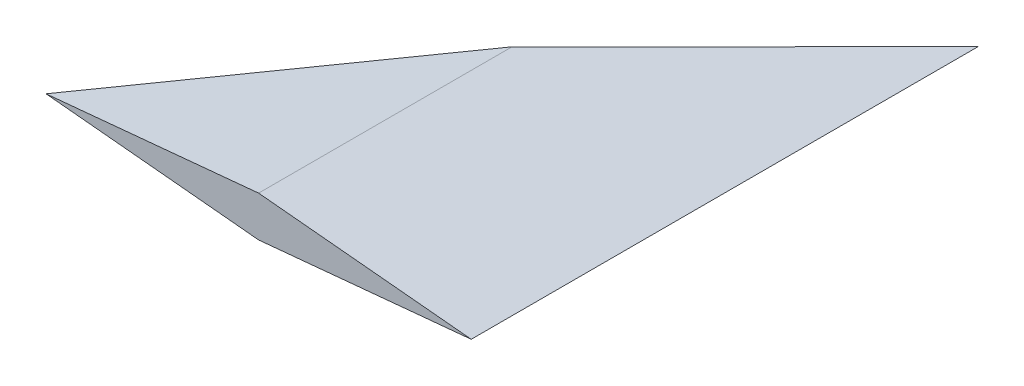
ISO-10303-21;
HEADER;
FILE_DESCRIPTION(('STEP AP214'),'2;1');
FILE_NAME('part.step','',(''),(''),'','','');
FILE_SCHEMA(('AUTOMOTIVE_DESIGN { 1 0 10303 214 1 1 1 1 }'));
ENDSEC;
DATA;
#1=APPLICATION_CONTEXT('core data for automotive mechanical design processes');
#2=APPLICATION_PROTOCOL_DEFINITION('international standard','automotive_design',2000,#1);
#3=PRODUCT_CONTEXT('',#1,'mechanical');
#4=PRODUCT('Part','Part','',(#3));
#5=PRODUCT_RELATED_PRODUCT_CATEGORY('part','',(#4));
#6=PRODUCT_DEFINITION_FORMATION('','',#4);
#7=PRODUCT_DEFINITION_CONTEXT('part definition',#1,'design');
#8=PRODUCT_DEFINITION('design','',#6,#7);
#9=PRODUCT_DEFINITION_SHAPE('','',#8);
#10=(LENGTH_UNIT() NAMED_UNIT(*) SI_UNIT(.MILLI.,.METRE.));
#11=(NAMED_UNIT(*) PLANE_ANGLE_UNIT() SI_UNIT($,.RADIAN.));
#12=(NAMED_UNIT(*) SI_UNIT($,.STERADIAN.) SOLID_ANGLE_UNIT());
#13=UNCERTAINTY_MEASURE_WITH_UNIT(LENGTH_MEASURE(1.E-05),#10,'distance_accuracy_value','');
#14=(GEOMETRIC_REPRESENTATION_CONTEXT(3) GLOBAL_UNCERTAINTY_ASSIGNED_CONTEXT((#13)) GLOBAL_UNIT_ASSIGNED_CONTEXT((#10,
#11,#12)) REPRESENTATION_CONTEXT('',''));
#15=CARTESIAN_POINT('',(0.,0.,0.));
#16=DIRECTION('',(0.,0.,1.));
#17=DIRECTION('',(1.,0.,0.));
#18=AXIS2_PLACEMENT_3D('',#15,#16,#17);
#19=CARTESIAN_POINT('',(-26.6126926162419,2.54,4.8851879341457));
#20=DIRECTION('',(0.766044443118982,0.,0.642787609686535));
#21=DIRECTION('',(0.642787609686535,0.,-0.766044443118982));
#22=AXIS2_PLACEMENT_3D('',#19,#20,#21);
#23=PLANE('',#22);
#24=DIRECTION('',(0.641581356541116,0.0612345646159783,-0.764606886599351));
#25=VECTOR('',#24,1.);
#26=CARTESIAN_POINT('',(-26.5627981833493,1.27476208331771,4.82572606449552));
#27=LINE('',#26,#25);
#28=CARTESIAN_POINT('',(-26.6126926162419,1.27,4.88518793414579));
#29=VERTEX_POINT('',#28);
#30=CARTESIAN_POINT('',(-13.3063463081209,2.54,-10.9726980828604));
#31=VERTEX_POINT('',#30);
#32=EDGE_CURVE('E135',#29,#31,#27,.T.);
#33=ORIENTED_EDGE('',*,*,#32,.T.);
#34=DIRECTION('',(0.641581356541116,-0.0612345646159783,-0.764606886599351));
#35=VECTOR('',#34,1.);
#36=CARTESIAN_POINT('',(-26.5627981833493,3.80523791668229,4.82572606449552));
#37=LINE('',#36,#35);
#38=CARTESIAN_POINT('',(0.,1.27,-26.8305840998664));
#39=VERTEX_POINT('',#38);
#40=EDGE_CURVE('E96',#31,#39,#37,.T.);
#41=ORIENTED_EDGE('',*,*,#40,.T.);
#42=DIRECTION('',(-0.641581356541116,-0.0612345646159783,0.764606886599351));
#43=VECTOR('',#42,1.);
#44=CARTESIAN_POINT('',(-26.4630093175642,-1.25571375004687,4.70680232519517));
#45=LINE('',#44,#43);
#46=CARTESIAN_POINT('',(-13.3063463081209,0.,-10.9726980828604));
#47=VERTEX_POINT('',#46);
#48=EDGE_CURVE('E137',#39,#47,#45,.T.);
#49=ORIENTED_EDGE('',*,*,#48,.T.);
#50=DIRECTION('',(-0.641581356541116,0.0612345646159783,0.764606886599351));
#51=VECTOR('',#50,1.);
#52=CARTESIAN_POINT('',(-26.6625870491345,1.27476208331771,4.94464980379588));
#53=LINE('',#52,#51);
#54=EDGE_CURVE('E103',#47,#29,#53,.T.);
#55=ORIENTED_EDGE('',*,*,#54,.T.);
#56=EDGE_LOOP('',(#33,#41,#49,#55));
#57=FACE_BOUND('',#56,.T.);
#58=ADVANCED_FACE('F81',(#57),#23,.F.);
#59=CARTESIAN_POINT('',(0.,2.54,4.88518793414579));
#60=DIRECTION('',(0.,0.,-1.));
#61=DIRECTION('',(-1.,0.,0.));
#62=AXIS2_PLACEMENT_3D('',#59,#60,#61);
#63=PLANE('',#62);
#64=DIRECTION('',(-0.995476183325323,-0.0950114121148024,0.));
#65=VECTOR('',#64,1.);
#66=CARTESIAN_POINT('',(-0.120118629338579,1.2585354960913,4.88518793414579));
#67=LINE('',#66,#65);
#68=CARTESIAN_POINT('',(0.,1.27,4.88518793414579));
#69=VERTEX_POINT('',#68);
#70=CARTESIAN_POINT('',(-13.3063463081209,0.,4.88518793414579));
#71=VERTEX_POINT('',#70);
#72=EDGE_CURVE('E130',#69,#71,#67,.T.);
#73=ORIENTED_EDGE('',*,*,#72,.F.);
#74=DIRECTION('',(0.995476183325323,-0.0950114121148024,0.));
#75=VECTOR('',#74,1.);
#76=CARTESIAN_POINT('',(0.120118629338579,1.2585354960913,4.88518793414579));
#77=LINE('',#76,#75);
#78=CARTESIAN_POINT('',(-13.3063463081209,2.54,4.88518793414579));
#79=VERTEX_POINT('',#78);
#80=EDGE_CURVE('E117',#79,#69,#77,.T.);
#81=ORIENTED_EDGE('',*,*,#80,.F.);
#82=DIRECTION('',(0.995476183325323,0.0950114121148024,0.));
#83=VECTOR('',#82,1.);
#84=CARTESIAN_POINT('',(-0.360355888015736,3.77560648827389,4.88518793414579));
#85=LINE('',#84,#83);
#86=EDGE_CURVE('E128',#29,#79,#85,.T.);
#87=ORIENTED_EDGE('',*,*,#86,.F.);
#88=DIRECTION('',(-0.995476183325323,0.0950114121148024,0.));
#89=VECTOR('',#88,1.);
#90=CARTESIAN_POINT('',(-0.120118629338579,-1.2585354960913,4.88518793414579));
#91=LINE('',#90,#89);
#92=EDGE_CURVE('E132',#71,#29,#91,.T.);
#93=ORIENTED_EDGE('',*,*,#92,.F.);
#94=EDGE_LOOP('',(#73,#81,#87,#93));
#95=FACE_BOUND('',#94,.T.);
#96=ADVANCED_FACE('F126',(#95),#63,.F.);
#97=CARTESIAN_POINT('',(-0.120118629338579,1.2585354960913,-47.6928120658542));
#98=DIRECTION('',(-0.0950114121148024,0.995476183325323,0.));
#99=DIRECTION('',(-0.995476183325323,-0.0950114121148024,0.));
#100=AXIS2_PLACEMENT_3D('',#97,#98,#99);
#101=PLANE('',#100);
#102=DIRECTION('',(0.,0.,1.));
#103=VECTOR('',#102,1.);
#104=CARTESIAN_POINT('',(0.,1.27,-47.6928120658542));
#105=LINE('',#104,#103);
#106=EDGE_CURVE('E138',#39,#69,#105,.T.);
#107=ORIENTED_EDGE('',*,*,#106,.T.);
#108=ORIENTED_EDGE('',*,*,#72,.T.);
#109=DIRECTION('',(0.,0.,1.));
#110=VECTOR('',#109,1.);
#111=CARTESIAN_POINT('',(-13.306346308121,0.,0.));
#112=LINE('',#111,#110);
#113=EDGE_CURVE('E89',#47,#71,#112,.T.);
#114=ORIENTED_EDGE('',*,*,#113,.F.);
#115=ORIENTED_EDGE('',*,*,#48,.F.);
#116=EDGE_LOOP('',(#107,#108,#114,#115));
#117=FACE_BOUND('',#116,.T.);
#118=ADVANCED_FACE('F154',(#117),#101,.F.);
#119=CARTESIAN_POINT('',(-0.360355888015736,3.77560648827389,-47.6928120658542));
#120=DIRECTION('',(0.0950114121148024,-0.995476183325323,0.));
#121=DIRECTION('',(0.995476183325323,0.0950114121148024,0.));
#122=AXIS2_PLACEMENT_3D('',#119,#120,#121);
#123=PLANE('',#122);
#124=ORIENTED_EDGE('',*,*,#86,.T.);
#125=DIRECTION('',(0.,0.,-1.));
#126=VECTOR('',#125,1.);
#127=CARTESIAN_POINT('',(-13.3063463081209,2.54,0.));
#128=LINE('',#127,#126);
#129=EDGE_CURVE('E12',#79,#31,#128,.T.);
#130=ORIENTED_EDGE('',*,*,#129,.T.);
#131=ORIENTED_EDGE('',*,*,#32,.F.);
#132=EDGE_LOOP('',(#124,#130,#131));
#133=FACE_BOUND('',#132,.T.);
#134=ADVANCED_FACE('F134',(#133),#123,.F.);
#135=CARTESIAN_POINT('',(0.120118629338579,1.2585354960913,-47.6928120658542));
#136=DIRECTION('',(-0.0950114121148024,-0.995476183325323,0.));
#137=DIRECTION('',(0.995476183325323,-0.0950114121148024,0.));
#138=AXIS2_PLACEMENT_3D('',#135,#136,#137);
#139=PLANE('',#138);
#140=ORIENTED_EDGE('',*,*,#129,.F.);
#141=ORIENTED_EDGE('',*,*,#80,.T.);
#142=ORIENTED_EDGE('',*,*,#106,.F.);
#143=ORIENTED_EDGE('',*,*,#40,.F.);
#144=EDGE_LOOP('',(#140,#141,#142,#143));
#145=FACE_BOUND('',#144,.T.);
#146=ADVANCED_FACE('F116',(#145),#139,.F.);
#147=CARTESIAN_POINT('',(-0.120118629338579,-1.2585354960913,-47.6928120658542));
#148=DIRECTION('',(0.0950114121148024,0.995476183325323,0.));
#149=DIRECTION('',(-0.995476183325323,0.0950114121148024,0.));
#150=AXIS2_PLACEMENT_3D('',#147,#148,#149);
#151=PLANE('',#150);
#152=ORIENTED_EDGE('',*,*,#113,.T.);
#153=ORIENTED_EDGE('',*,*,#92,.T.);
#154=ORIENTED_EDGE('',*,*,#54,.F.);
#155=EDGE_LOOP('',(#152,#153,#154));
#156=FACE_BOUND('',#155,.T.);
#157=ADVANCED_FACE('F149',(#156),#151,.F.);
#158=CLOSED_SHELL('',(#58,#96,#118,#134,#146,#157));
#159=MANIFOLD_SOLID_BREP('B2',#158);
#160=ADVANCED_BREP_SHAPE_REPRESENTATION('',(#18,#159),#14);
#161=SHAPE_DEFINITION_REPRESENTATION(#9,#160);
ENDSEC;
END-ISO-10303-21;
